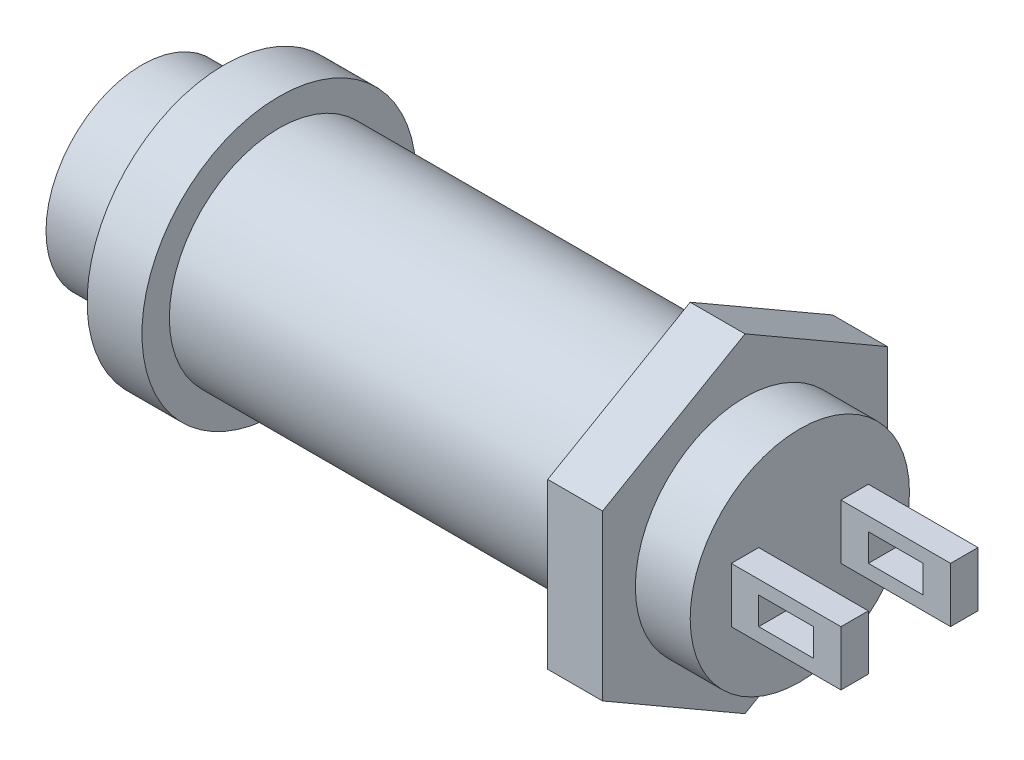
ISO-10303-21;
HEADER;
FILE_DESCRIPTION(('STEP AP214'),'2;1');
FILE_NAME('part.step','',(''),(''),'','','');
FILE_SCHEMA(('AUTOMOTIVE_DESIGN { 1 0 10303 214 1 1 1 1 }'));
ENDSEC;
DATA;
#1=APPLICATION_CONTEXT('core data for automotive mechanical design processes');
#2=APPLICATION_PROTOCOL_DEFINITION('international standard','automotive_design',2000,#1);
#3=PRODUCT_CONTEXT('',#1,'mechanical');
#4=PRODUCT('Part','Part','',(#3));
#5=PRODUCT_RELATED_PRODUCT_CATEGORY('part','',(#4));
#6=PRODUCT_DEFINITION_FORMATION('','',#4);
#7=PRODUCT_DEFINITION_CONTEXT('part definition',#1,'design');
#8=PRODUCT_DEFINITION('design','',#6,#7);
#9=PRODUCT_DEFINITION_SHAPE('','',#8);
#10=(LENGTH_UNIT() NAMED_UNIT(*) SI_UNIT(.MILLI.,.METRE.));
#11=(NAMED_UNIT(*) PLANE_ANGLE_UNIT() SI_UNIT($,.RADIAN.));
#12=(NAMED_UNIT(*) SI_UNIT($,.STERADIAN.) SOLID_ANGLE_UNIT());
#13=UNCERTAINTY_MEASURE_WITH_UNIT(LENGTH_MEASURE(1.E-05),#10,'distance_accuracy_value','');
#14=(GEOMETRIC_REPRESENTATION_CONTEXT(3) GLOBAL_UNCERTAINTY_ASSIGNED_CONTEXT((#13)) GLOBAL_UNIT_ASSIGNED_CONTEXT((#10,
#11,#12)) REPRESENTATION_CONTEXT('',''));
#15=CARTESIAN_POINT('',(0.,0.,0.));
#16=DIRECTION('',(0.,0.,1.));
#17=DIRECTION('',(1.,0.,0.));
#18=AXIS2_PLACEMENT_3D('',#15,#16,#17);
#19=CARTESIAN_POINT('',(28.,-1.00116314183368,2.5));
#20=DIRECTION('',(0.,0.,1.));
#21=DIRECTION('',(1.,0.,0.));
#22=AXIS2_PLACEMENT_3D('',#19,#20,#21);
#23=PLANE('',#22);
#24=DIRECTION('',(0.,1.,0.));
#25=VECTOR('',#24,1.);
#26=CARTESIAN_POINT('',(24.,-1.00116314183368,2.5));
#27=LINE('',#26,#25);
#28=CARTESIAN_POINT('',(24.,-1.00116314183368,2.5));
#29=VERTEX_POINT('',#28);
#30=CARTESIAN_POINT('',(24.,0.998836858166317,2.5));
#31=VERTEX_POINT('',#30);
#32=EDGE_CURVE('E269',#29,#31,#27,.T.);
#33=ORIENTED_EDGE('',*,*,#32,.F.);
#34=DIRECTION('',(-1.,0.,0.));
#35=VECTOR('',#34,1.);
#36=CARTESIAN_POINT('',(28.,-1.00116314183368,2.5));
#37=LINE('',#36,#35);
#38=CARTESIAN_POINT('',(28.,-1.00116314183368,2.5));
#39=VERTEX_POINT('',#38);
#40=EDGE_CURVE('E298',#39,#29,#37,.T.);
#41=ORIENTED_EDGE('',*,*,#40,.F.);
#42=DIRECTION('',(0.,1.,0.));
#43=VECTOR('',#42,1.);
#44=CARTESIAN_POINT('',(28.,-1.00116314183368,2.5));
#45=LINE('',#44,#43);
#46=CARTESIAN_POINT('',(28.,0.998836858166317,2.5));
#47=VERTEX_POINT('',#46);
#48=EDGE_CURVE('E278',#39,#47,#45,.T.);
#49=ORIENTED_EDGE('',*,*,#48,.T.);
#50=DIRECTION('',(-1.,0.,0.));
#51=VECTOR('',#50,1.);
#52=CARTESIAN_POINT('',(28.,0.998836858166317,2.5));
#53=LINE('',#52,#51);
#54=EDGE_CURVE('E289',#47,#31,#53,.T.);
#55=ORIENTED_EDGE('',*,*,#54,.T.);
#56=EDGE_LOOP('',(#33,#41,#49,#55));
#57=FACE_BOUND('',#56,.T.);
#58=DIRECTION('',(1.,0.,0.));
#59=VECTOR('',#58,1.);
#60=CARTESIAN_POINT('',(28.,0.5,2.5));
#61=LINE('',#60,#59);
#62=CARTESIAN_POINT('',(25.,0.5,2.5));
#63=VERTEX_POINT('',#62);
#64=CARTESIAN_POINT('',(27.,0.5,2.5));
#65=VERTEX_POINT('',#64);
#66=EDGE_CURVE('E236',#63,#65,#61,.T.);
#67=ORIENTED_EDGE('',*,*,#66,.T.);
#68=DIRECTION('',(0.,-1.,0.));
#69=VECTOR('',#68,1.);
#70=CARTESIAN_POINT('',(27.,-1.00116314183368,2.5));
#71=LINE('',#70,#69);
#72=CARTESIAN_POINT('',(27.,-0.5,2.5));
#73=VERTEX_POINT('',#72);
#74=EDGE_CURVE('E242',#65,#73,#71,.T.);
#75=ORIENTED_EDGE('',*,*,#74,.T.);
#76=DIRECTION('',(1.,0.,0.));
#77=VECTOR('',#76,1.);
#78=CARTESIAN_POINT('',(28.,-0.5,2.5));
#79=LINE('',#78,#77);
#80=CARTESIAN_POINT('',(25.,-0.5,2.5));
#81=VERTEX_POINT('',#80);
#82=EDGE_CURVE('E222',#81,#73,#79,.T.);
#83=ORIENTED_EDGE('',*,*,#82,.F.);
#84=DIRECTION('',(0.,-1.,0.));
#85=VECTOR('',#84,1.);
#86=CARTESIAN_POINT('',(25.,-1.00116314183368,2.5));
#87=LINE('',#86,#85);
#88=EDGE_CURVE('E230',#63,#81,#87,.T.);
#89=ORIENTED_EDGE('',*,*,#88,.F.);
#90=EDGE_LOOP('',(#67,#75,#83,#89));
#91=FACE_BOUND('',#90,.T.);
#92=ADVANCED_FACE('F33',(#57,#91),#23,.T.);
#93=CARTESIAN_POINT('',(28.,-1.00116314183368,1.5));
#94=DIRECTION('',(0.,0.,1.));
#95=DIRECTION('',(1.,0.,0.));
#96=AXIS2_PLACEMENT_3D('',#93,#94,#95);
#97=PLANE('',#96);
#98=DIRECTION('',(0.,1.,0.));
#99=VECTOR('',#98,1.);
#100=CARTESIAN_POINT('',(24.,-1.00116314183368,1.5));
#101=LINE('',#100,#99);
#102=CARTESIAN_POINT('',(24.,-1.00116314183368,1.5));
#103=VERTEX_POINT('',#102);
#104=CARTESIAN_POINT('',(24.,0.998836858166317,1.5));
#105=VERTEX_POINT('',#104);
#106=EDGE_CURVE('E293',#103,#105,#101,.T.);
#107=ORIENTED_EDGE('',*,*,#106,.T.);
#108=DIRECTION('',(-1.,0.,0.));
#109=VECTOR('',#108,1.);
#110=CARTESIAN_POINT('',(28.,0.998836858166317,1.5));
#111=LINE('',#110,#109);
#112=CARTESIAN_POINT('',(28.,0.998836858166317,1.5));
#113=VERTEX_POINT('',#112);
#114=EDGE_CURVE('E305',#113,#105,#111,.T.);
#115=ORIENTED_EDGE('',*,*,#114,.F.);
#116=DIRECTION('',(0.,1.,0.));
#117=VECTOR('',#116,1.);
#118=CARTESIAN_POINT('',(28.,-1.00116314183368,1.5));
#119=LINE('',#118,#117);
#120=CARTESIAN_POINT('',(28.,-1.00116314183368,1.5));
#121=VERTEX_POINT('',#120);
#122=EDGE_CURVE('E285',#121,#113,#119,.T.);
#123=ORIENTED_EDGE('',*,*,#122,.F.);
#124=DIRECTION('',(-1.,0.,0.));
#125=VECTOR('',#124,1.);
#126=CARTESIAN_POINT('',(28.,-1.00116314183368,1.5));
#127=LINE('',#126,#125);
#128=EDGE_CURVE('E302',#121,#103,#127,.T.);
#129=ORIENTED_EDGE('',*,*,#128,.T.);
#130=EDGE_LOOP('',(#107,#115,#123,#129));
#131=FACE_BOUND('',#130,.T.);
#132=DIRECTION('',(0.,-1.,0.));
#133=VECTOR('',#132,1.);
#134=CARTESIAN_POINT('',(27.,-1.00116314183368,1.5));
#135=LINE('',#134,#133);
#136=CARTESIAN_POINT('',(27.,0.5,1.5));
#137=VERTEX_POINT('',#136);
#138=CARTESIAN_POINT('',(27.,-0.5,1.5));
#139=VERTEX_POINT('',#138);
#140=EDGE_CURVE('E240',#137,#139,#135,.T.);
#141=ORIENTED_EDGE('',*,*,#140,.F.);
#142=DIRECTION('',(1.,0.,0.));
#143=VECTOR('',#142,1.);
#144=CARTESIAN_POINT('',(28.,0.5,1.5));
#145=LINE('',#144,#143);
#146=CARTESIAN_POINT('',(25.,0.5,1.5));
#147=VERTEX_POINT('',#146);
#148=EDGE_CURVE('E234',#147,#137,#145,.T.);
#149=ORIENTED_EDGE('',*,*,#148,.F.);
#150=DIRECTION('',(0.,-1.,0.));
#151=VECTOR('',#150,1.);
#152=CARTESIAN_POINT('',(25.,-1.00116314183368,1.5));
#153=LINE('',#152,#151);
#154=CARTESIAN_POINT('',(25.,-0.5,1.5));
#155=VERTEX_POINT('',#154);
#156=EDGE_CURVE('E227',#147,#155,#153,.T.);
#157=ORIENTED_EDGE('',*,*,#156,.T.);
#158=DIRECTION('',(1.,0.,0.));
#159=VECTOR('',#158,1.);
#160=CARTESIAN_POINT('',(28.,-0.5,1.5));
#161=LINE('',#160,#159);
#162=EDGE_CURVE('E219',#155,#139,#161,.T.);
#163=ORIENTED_EDGE('',*,*,#162,.T.);
#164=EDGE_LOOP('',(#141,#149,#157,#163));
#165=FACE_BOUND('',#164,.T.);
#166=ADVANCED_FACE('F400',(#131,#165),#97,.F.);
#167=CARTESIAN_POINT('',(28.,-1.,-1.5));
#168=DIRECTION('',(0.,0.,1.));
#169=DIRECTION('',(1.,0.,0.));
#170=AXIS2_PLACEMENT_3D('',#167,#168,#169);
#171=PLANE('',#170);
#172=DIRECTION('',(0.,1.,0.));
#173=VECTOR('',#172,1.);
#174=CARTESIAN_POINT('',(24.,-1.,-1.5));
#175=LINE('',#174,#173);
#176=CARTESIAN_POINT('',(24.,-1.,-1.5));
#177=VERTEX_POINT('',#176);
#178=CARTESIAN_POINT('',(24.,1.,-1.5));
#179=VERTEX_POINT('',#178);
#180=EDGE_CURVE('E267',#177,#179,#175,.T.);
#181=ORIENTED_EDGE('',*,*,#180,.F.);
#182=DIRECTION('',(-1.,0.,0.));
#183=VECTOR('',#182,1.);
#184=CARTESIAN_POINT('',(28.,-1.,-1.5));
#185=LINE('',#184,#183);
#186=CARTESIAN_POINT('',(28.,-1.,-1.5));
#187=VERTEX_POINT('',#186);
#188=EDGE_CURVE('E245',#187,#177,#185,.T.);
#189=ORIENTED_EDGE('',*,*,#188,.F.);
#190=DIRECTION('',(0.,1.,0.));
#191=VECTOR('',#190,1.);
#192=CARTESIAN_POINT('',(28.,-1.,-1.5));
#193=LINE('',#192,#191);
#194=CARTESIAN_POINT('',(28.,1.,-1.5));
#195=VERTEX_POINT('',#194);
#196=EDGE_CURVE('E262',#187,#195,#193,.T.);
#197=ORIENTED_EDGE('',*,*,#196,.T.);
#198=DIRECTION('',(-1.,0.,0.));
#199=VECTOR('',#198,1.);
#200=CARTESIAN_POINT('',(28.,1.,-1.5));
#201=LINE('',#200,#199);
#202=EDGE_CURVE('E246',#195,#179,#201,.T.);
#203=ORIENTED_EDGE('',*,*,#202,.T.);
#204=EDGE_LOOP('',(#181,#189,#197,#203));
#205=FACE_BOUND('',#204,.T.);
#206=DIRECTION('',(1.,0.,0.));
#207=VECTOR('',#206,1.);
#208=CARTESIAN_POINT('',(28.,0.5,-1.5));
#209=LINE('',#208,#207);
#210=CARTESIAN_POINT('',(25.,0.5,-1.5));
#211=VERTEX_POINT('',#210);
#212=CARTESIAN_POINT('',(27.,0.5,-1.5));
#213=VERTEX_POINT('',#212);
#214=EDGE_CURVE('E232',#211,#213,#209,.T.);
#215=ORIENTED_EDGE('',*,*,#214,.T.);
#216=DIRECTION('',(0.,-1.,0.));
#217=VECTOR('',#216,1.);
#218=CARTESIAN_POINT('',(27.,-1.,-1.5));
#219=LINE('',#218,#217);
#220=CARTESIAN_POINT('',(27.,-0.5,-1.5));
#221=VERTEX_POINT('',#220);
#222=EDGE_CURVE('E188',#213,#221,#219,.T.);
#223=ORIENTED_EDGE('',*,*,#222,.T.);
#224=DIRECTION('',(1.,0.,0.));
#225=VECTOR('',#224,1.);
#226=CARTESIAN_POINT('',(28.,-0.5,-1.5));
#227=LINE('',#226,#225);
#228=CARTESIAN_POINT('',(25.,-0.5,-1.5));
#229=VERTEX_POINT('',#228);
#230=EDGE_CURVE('E217',#229,#221,#227,.T.);
#231=ORIENTED_EDGE('',*,*,#230,.F.);
#232=DIRECTION('',(0.,-1.,0.));
#233=VECTOR('',#232,1.);
#234=CARTESIAN_POINT('',(25.,-1.,-1.5));
#235=LINE('',#234,#233);
#236=EDGE_CURVE('E224',#211,#229,#235,.T.);
#237=ORIENTED_EDGE('',*,*,#236,.F.);
#238=EDGE_LOOP('',(#215,#223,#231,#237));
#239=FACE_BOUND('',#238,.T.);
#240=ADVANCED_FACE('F406',(#205,#239),#171,.T.);
#241=CARTESIAN_POINT('',(28.,-1.,-2.5));
#242=DIRECTION('',(0.,0.,1.));
#243=DIRECTION('',(1.,0.,0.));
#244=AXIS2_PLACEMENT_3D('',#241,#242,#243);
#245=PLANE('',#244);
#246=DIRECTION('',(0.,1.,0.));
#247=VECTOR('',#246,1.);
#248=CARTESIAN_POINT('',(24.,-1.,-2.5));
#249=LINE('',#248,#247);
#250=CARTESIAN_POINT('',(24.,-1.,-2.5));
#251=VERTEX_POINT('',#250);
#252=CARTESIAN_POINT('',(24.,1.,-2.5));
#253=VERTEX_POINT('',#252);
#254=EDGE_CURVE('E261',#251,#253,#249,.T.);
#255=ORIENTED_EDGE('',*,*,#254,.T.);
#256=DIRECTION('',(-1.,0.,0.));
#257=VECTOR('',#256,1.);
#258=CARTESIAN_POINT('',(28.,1.,-2.5));
#259=LINE('',#258,#257);
#260=CARTESIAN_POINT('',(28.,1.,-2.5));
#261=VERTEX_POINT('',#260);
#262=EDGE_CURVE('E250',#261,#253,#259,.T.);
#263=ORIENTED_EDGE('',*,*,#262,.F.);
#264=DIRECTION('',(0.,1.,0.));
#265=VECTOR('',#264,1.);
#266=CARTESIAN_POINT('',(28.,-1.,-2.5));
#267=LINE('',#266,#265);
#268=CARTESIAN_POINT('',(28.,-1.,-2.5));
#269=VERTEX_POINT('',#268);
#270=EDGE_CURVE('E271',#269,#261,#267,.T.);
#271=ORIENTED_EDGE('',*,*,#270,.F.);
#272=DIRECTION('',(-1.,0.,0.));
#273=VECTOR('',#272,1.);
#274=CARTESIAN_POINT('',(28.,-1.,-2.5));
#275=LINE('',#274,#273);
#276=EDGE_CURVE('E253',#269,#251,#275,.T.);
#277=ORIENTED_EDGE('',*,*,#276,.T.);
#278=EDGE_LOOP('',(#255,#263,#271,#277));
#279=FACE_BOUND('',#278,.T.);
#280=DIRECTION('',(0.,1.,0.));
#281=VECTOR('',#280,1.);
#282=CARTESIAN_POINT('',(27.,-0.5,-2.5));
#283=LINE('',#282,#281);
#284=CARTESIAN_POINT('',(27.,-0.5,-2.5));
#285=VERTEX_POINT('',#284);
#286=CARTESIAN_POINT('',(27.,0.5,-2.5));
#287=VERTEX_POINT('',#286);
#288=EDGE_CURVE('E185',#285,#287,#283,.T.);
#289=ORIENTED_EDGE('',*,*,#288,.T.);
#290=DIRECTION('',(-1.,0.,0.));
#291=VECTOR('',#290,1.);
#292=CARTESIAN_POINT('',(27.,0.5,-2.5));
#293=LINE('',#292,#291);
#294=CARTESIAN_POINT('',(25.,0.5,-2.5));
#295=VERTEX_POINT('',#294);
#296=EDGE_CURVE('E195',#287,#295,#293,.T.);
#297=ORIENTED_EDGE('',*,*,#296,.T.);
#298=DIRECTION('',(0.,1.,0.));
#299=VECTOR('',#298,1.);
#300=CARTESIAN_POINT('',(25.,-0.5,-2.5));
#301=LINE('',#300,#299);
#302=CARTESIAN_POINT('',(25.,-0.5,-2.5));
#303=VERTEX_POINT('',#302);
#304=EDGE_CURVE('E202',#303,#295,#301,.T.);
#305=ORIENTED_EDGE('',*,*,#304,.F.);
#306=DIRECTION('',(-1.,0.,0.));
#307=VECTOR('',#306,1.);
#308=CARTESIAN_POINT('',(27.,-0.5,-2.5));
#309=LINE('',#308,#307);
#310=EDGE_CURVE('E207',#285,#303,#309,.T.);
#311=ORIENTED_EDGE('',*,*,#310,.F.);
#312=EDGE_LOOP('',(#289,#297,#305,#311));
#313=FACE_BOUND('',#312,.T.);
#314=ADVANCED_FACE('F205',(#279,#313),#245,.F.);
#315=CARTESIAN_POINT('',(20.,4.,0.));
#316=DIRECTION('',(-1.,0.,0.));
#317=DIRECTION('',(0.,-1.,0.));
#318=AXIS2_PLACEMENT_3D('',#315,#316,#317);
#319=PLANE('',#318);
#320=CARTESIAN_POINT('',(20.,0.,0.));
#321=DIRECTION('',(1.,0.,0.));
#322=DIRECTION('',(0.,1.,0.));
#323=AXIS2_PLACEMENT_3D('',#320,#321,#322);
#324=CIRCLE('',#323,4.);
#325=CARTESIAN_POINT('',(20.,4.,0.));
#326=VERTEX_POINT('',#325);
#327=EDGE_CURVE('E359',#326,#326,#324,.T.);
#328=ORIENTED_EDGE('',*,*,#327,.T.);
#329=EDGE_LOOP('',(#328));
#330=FACE_BOUND('',#329,.T.);
#331=DIRECTION('',(0.,-0.499999999999995,-0.866025403784442));
#332=VECTOR('',#331,1.);
#333=CARTESIAN_POINT('',(20.,-4.50000000000001,2.59807621135329));
#334=LINE('',#333,#332);
#335=CARTESIAN_POINT('',(20.,-3.00000000000002,5.19615242270662));
#336=VERTEX_POINT('',#335);
#337=CARTESIAN_POINT('',(20.,-6.,0.));
#338=VERTEX_POINT('',#337);
#339=EDGE_CURVE('E317',#336,#338,#334,.T.);
#340=ORIENTED_EDGE('',*,*,#339,.F.);
#341=DIRECTION('',(0.,-1.,0.));
#342=VECTOR('',#341,1.);
#343=CARTESIAN_POINT('',(20.,0.,5.19615242270663));
#344=LINE('',#343,#342);
#345=CARTESIAN_POINT('',(20.,2.99999999999999,5.19615242270664));
#346=VERTEX_POINT('',#345);
#347=EDGE_CURVE('E310',#346,#336,#344,.T.);
#348=ORIENTED_EDGE('',*,*,#347,.F.);
#349=DIRECTION('',(0.,-0.500000000000001,0.866025403784438));
#350=VECTOR('',#349,1.);
#351=CARTESIAN_POINT('',(20.,4.49999999999999,2.59807621135332));
#352=LINE('',#351,#350);
#353=CARTESIAN_POINT('',(20.,6.,0.));
#354=VERTEX_POINT('',#353);
#355=EDGE_CURVE('E343',#354,#346,#352,.T.);
#356=ORIENTED_EDGE('',*,*,#355,.F.);
#357=DIRECTION('',(0.,0.499999999999995,0.866025403784442));
#358=VECTOR('',#357,1.);
#359=CARTESIAN_POINT('',(20.,4.50000000000003,-2.5980762113533));
#360=LINE('',#359,#358);
#361=CARTESIAN_POINT('',(20.,3.00000000000006,-5.1961524227066));
#362=VERTEX_POINT('',#361);
#363=EDGE_CURVE('E338',#362,#354,#360,.T.);
#364=ORIENTED_EDGE('',*,*,#363,.F.);
#365=DIRECTION('',(0.,1.,0.));
#366=VECTOR('',#365,1.);
#367=CARTESIAN_POINT('',(20.,0.,-5.19615242270663));
#368=LINE('',#367,#366);
#369=CARTESIAN_POINT('',(20.,-2.99999999999995,-5.19615242270666));
#370=VERTEX_POINT('',#369);
#371=EDGE_CURVE('E331',#370,#362,#368,.T.);
#372=ORIENTED_EDGE('',*,*,#371,.F.);
#373=DIRECTION('',(0.,0.500000000000007,-0.866025403784435));
#374=VECTOR('',#373,1.);
#375=CARTESIAN_POINT('',(20.,-4.49999999999998,-2.59807621135335));
#376=LINE('',#375,#374);
#377=EDGE_CURVE('E324',#338,#370,#376,.T.);
#378=ORIENTED_EDGE('',*,*,#377,.F.);
#379=EDGE_LOOP('',(#340,#348,#356,#364,#372,#378));
#380=FACE_BOUND('',#379,.T.);
#381=ADVANCED_FACE('F450',(#330,#380),#319,.T.);
#382=CARTESIAN_POINT('',(22.,6.,0.));
#383=DIRECTION('',(1.,0.,0.));
#384=DIRECTION('',(0.,1.,0.));
#385=AXIS2_PLACEMENT_3D('',#382,#383,#384);
#386=PLANE('',#385);
#387=CARTESIAN_POINT('',(22.,0.,0.));
#388=DIRECTION('',(1.,0.,0.));
#389=DIRECTION('',(0.,1.,0.));
#390=AXIS2_PLACEMENT_3D('',#387,#388,#389);
#391=CIRCLE('',#390,4.);
#392=CARTESIAN_POINT('',(22.,4.,0.));
#393=VERTEX_POINT('',#392);
#394=EDGE_CURVE('E356',#393,#393,#391,.T.);
#395=ORIENTED_EDGE('',*,*,#394,.F.);
#396=EDGE_LOOP('',(#395));
#397=FACE_BOUND('',#396,.T.);
#398=DIRECTION('',(0.,-0.500000000000001,0.866025403784438));
#399=VECTOR('',#398,1.);
#400=CARTESIAN_POINT('',(22.,4.49999999999999,2.59807621135332));
#401=LINE('',#400,#399);
#402=CARTESIAN_POINT('',(22.,6.,0.));
#403=VERTEX_POINT('',#402);
#404=CARTESIAN_POINT('',(22.,2.99999999999999,5.19615242270664));
#405=VERTEX_POINT('',#404);
#406=EDGE_CURVE('E342',#403,#405,#401,.T.);
#407=ORIENTED_EDGE('',*,*,#406,.T.);
#408=DIRECTION('',(0.,-1.,0.));
#409=VECTOR('',#408,1.);
#410=CARTESIAN_POINT('',(22.,0.,5.19615242270663));
#411=LINE('',#410,#409);
#412=CARTESIAN_POINT('',(22.,-3.00000000000002,5.19615242270662));
#413=VERTEX_POINT('',#412);
#414=EDGE_CURVE('E301',#405,#413,#411,.T.);
#415=ORIENTED_EDGE('',*,*,#414,.T.);
#416=DIRECTION('',(0.,-0.499999999999995,-0.866025403784442));
#417=VECTOR('',#416,1.);
#418=CARTESIAN_POINT('',(22.,-4.50000000000001,2.59807621135329));
#419=LINE('',#418,#417);
#420=CARTESIAN_POINT('',(22.,-6.,0.));
#421=VERTEX_POINT('',#420);
#422=EDGE_CURVE('E312',#413,#421,#419,.T.);
#423=ORIENTED_EDGE('',*,*,#422,.T.);
#424=DIRECTION('',(0.,0.500000000000007,-0.866025403784435));
#425=VECTOR('',#424,1.);
#426=CARTESIAN_POINT('',(22.,-4.49999999999998,-2.59807621135335));
#427=LINE('',#426,#425);
#428=CARTESIAN_POINT('',(22.,-2.99999999999995,-5.19615242270666));
#429=VERTEX_POINT('',#428);
#430=EDGE_CURVE('E321',#421,#429,#427,.T.);
#431=ORIENTED_EDGE('',*,*,#430,.T.);
#432=DIRECTION('',(0.,1.,0.));
#433=VECTOR('',#432,1.);
#434=CARTESIAN_POINT('',(22.,0.,-5.19615242270663));
#435=LINE('',#434,#433);
#436=CARTESIAN_POINT('',(22.,3.00000000000006,-5.1961524227066));
#437=VERTEX_POINT('',#436);
#438=EDGE_CURVE('E328',#429,#437,#435,.T.);
#439=ORIENTED_EDGE('',*,*,#438,.T.);
#440=DIRECTION('',(0.,0.499999999999995,0.866025403784442));
#441=VECTOR('',#440,1.);
#442=CARTESIAN_POINT('',(22.,4.50000000000003,-2.5980762113533));
#443=LINE('',#442,#441);
#444=EDGE_CURVE('E335',#437,#403,#443,.T.);
#445=ORIENTED_EDGE('',*,*,#444,.T.);
#446=EDGE_LOOP('',(#407,#415,#423,#431,#439,#445));
#447=FACE_BOUND('',#446,.T.);
#448=ADVANCED_FACE('F397',(#397,#447),#386,.T.);
#449=CARTESIAN_POINT('',(0.,0.,0.));
#450=DIRECTION('',(-1.,0.,0.));
#451=DIRECTION('',(0.,-1.,0.));
#452=AXIS2_PLACEMENT_3D('',#449,#450,#451);
#453=PLANE('',#452);
#454=CARTESIAN_POINT('',(0.,0.,0.));
#455=DIRECTION('',(1.,0.,0.));
#456=DIRECTION('',(0.,1.,0.));
#457=AXIS2_PLACEMENT_3D('',#454,#455,#456);
#458=CIRCLE('',#457,0.5);
#459=CARTESIAN_POINT('',(0.,0.5,0.));
#460=VERTEX_POINT('',#459);
#461=EDGE_CURVE('E11',#460,#460,#458,.T.);
#462=ORIENTED_EDGE('',*,*,#461,.F.);
#463=EDGE_LOOP('',(#462));
#464=FACE_BOUND('',#463,.T.);
#465=ADVANCED_FACE('F35',(#464),#453,.T.);
#466=CARTESIAN_POINT('',(24.,0.,0.));
#467=DIRECTION('',(1.,0.,0.));
#468=DIRECTION('',(0.,1.,0.));
#469=AXIS2_PLACEMENT_3D('',#466,#467,#468);
#470=CYLINDRICAL_SURFACE('',#469,0.5);
#471=ORIENTED_EDGE('',*,*,#461,.T.);
#472=EDGE_LOOP('',(#471));
#473=FACE_BOUND('',#472,.T.);
#474=CARTESIAN_POINT('',(10.,0.,0.));
#475=DIRECTION('',(1.,0.,0.));
#476=DIRECTION('',(0.,1.,0.));
#477=AXIS2_PLACEMENT_3D('',#474,#475,#476);
#478=CIRCLE('',#477,0.5);
#479=CARTESIAN_POINT('',(10.,0.5,0.));
#480=VERTEX_POINT('',#479);
#481=EDGE_CURVE('E41',#480,#480,#478,.T.);
#482=ORIENTED_EDGE('',*,*,#481,.F.);
#483=EDGE_LOOP('',(#482));
#484=FACE_BOUND('',#483,.T.);
#485=ADVANCED_FACE('F388',(#473,#484),#470,.T.);
#486=CARTESIAN_POINT('',(10.,0.5,0.));
#487=DIRECTION('',(-1.,0.,0.));
#488=DIRECTION('',(0.,-1.,0.));
#489=AXIS2_PLACEMENT_3D('',#486,#487,#488);
#490=PLANE('',#489);
#491=ORIENTED_EDGE('',*,*,#481,.T.);
#492=EDGE_LOOP('',(#491));
#493=FACE_BOUND('',#492,.T.);
#494=CARTESIAN_POINT('',(10.,0.,0.));
#495=DIRECTION('',(1.,0.,0.));
#496=DIRECTION('',(0.,1.,0.));
#497=AXIS2_PLACEMENT_3D('',#494,#495,#496);
#498=CIRCLE('',#497,2.5);
#499=CARTESIAN_POINT('',(10.,2.5,0.));
#500=VERTEX_POINT('',#499);
#501=EDGE_CURVE('E380',#500,#500,#498,.T.);
#502=ORIENTED_EDGE('',*,*,#501,.F.);
#503=EDGE_LOOP('',(#502));
#504=FACE_BOUND('',#503,.T.);
#505=ADVANCED_FACE('F385',(#493,#504),#490,.T.);
#506=CARTESIAN_POINT('',(24.,0.,0.));
#507=DIRECTION('',(1.,0.,0.));
#508=DIRECTION('',(0.,1.,0.));
#509=AXIS2_PLACEMENT_3D('',#506,#507,#508);
#510=CYLINDRICAL_SURFACE('',#509,2.5);
#511=ORIENTED_EDGE('',*,*,#501,.T.);
#512=EDGE_LOOP('',(#511));
#513=FACE_BOUND('',#512,.T.);
#514=CARTESIAN_POINT('',(0.,0.,0.));
#515=DIRECTION('',(1.,0.,0.));
#516=DIRECTION('',(0.,1.,0.));
#517=AXIS2_PLACEMENT_3D('',#514,#515,#516);
#518=CIRCLE('',#517,2.5);
#519=CARTESIAN_POINT('',(0.,2.5,0.));
#520=VERTEX_POINT('',#519);
#521=EDGE_CURVE('E377',#520,#520,#518,.T.);
#522=ORIENTED_EDGE('',*,*,#521,.F.);
#523=EDGE_LOOP('',(#522));
#524=FACE_BOUND('',#523,.T.);
#525=ADVANCED_FACE('F395',(#513,#524),#510,.F.);
#526=CARTESIAN_POINT('',(0.,2.5,0.));
#527=DIRECTION('',(-1.,0.,0.));
#528=DIRECTION('',(0.,-1.,0.));
#529=AXIS2_PLACEMENT_3D('',#526,#527,#528);
#530=PLANE('',#529);
#531=ORIENTED_EDGE('',*,*,#521,.T.);
#532=EDGE_LOOP('',(#531));
#533=FACE_BOUND('',#532,.T.);
#534=CARTESIAN_POINT('',(0.,0.,0.));
#535=DIRECTION('',(1.,0.,0.));
#536=DIRECTION('',(0.,1.,0.));
#537=AXIS2_PLACEMENT_3D('',#534,#535,#536);
#538=CIRCLE('',#537,3.5);
#539=CARTESIAN_POINT('',(0.,3.5,0.));
#540=VERTEX_POINT('',#539);
#541=EDGE_CURVE('E374',#540,#540,#538,.T.);
#542=ORIENTED_EDGE('',*,*,#541,.F.);
#543=EDGE_LOOP('',(#542));
#544=FACE_BOUND('',#543,.T.);
#545=ADVANCED_FACE('F473',(#533,#544),#530,.T.);
#546=CARTESIAN_POINT('',(24.,0.,0.));
#547=DIRECTION('',(1.,0.,0.));
#548=DIRECTION('',(0.,1.,0.));
#549=AXIS2_PLACEMENT_3D('',#546,#547,#548);
#550=CYLINDRICAL_SURFACE('',#549,3.5);
#551=ORIENTED_EDGE('',*,*,#541,.T.);
#552=EDGE_LOOP('',(#551));
#553=FACE_BOUND('',#552,.T.);
#554=CARTESIAN_POINT('',(3.,0.,0.));
#555=DIRECTION('',(1.,0.,0.));
#556=DIRECTION('',(0.,1.,0.));
#557=AXIS2_PLACEMENT_3D('',#554,#555,#556);
#558=CIRCLE('',#557,3.5);
#559=CARTESIAN_POINT('',(3.,3.5,0.));
#560=VERTEX_POINT('',#559);
#561=EDGE_CURVE('E371',#560,#560,#558,.T.);
#562=ORIENTED_EDGE('',*,*,#561,.F.);
#563=EDGE_LOOP('',(#562));
#564=FACE_BOUND('',#563,.T.);
#565=ADVANCED_FACE('F469',(#553,#564),#550,.T.);
#566=CARTESIAN_POINT('',(3.,3.5,0.));
#567=DIRECTION('',(-1.,0.,0.));
#568=DIRECTION('',(0.,-1.,0.));
#569=AXIS2_PLACEMENT_3D('',#566,#567,#568);
#570=PLANE('',#569);
#571=ORIENTED_EDGE('',*,*,#561,.T.);
#572=EDGE_LOOP('',(#571));
#573=FACE_BOUND('',#572,.T.);
#574=CARTESIAN_POINT('',(3.,0.,0.));
#575=DIRECTION('',(1.,0.,0.));
#576=DIRECTION('',(0.,1.,0.));
#577=AXIS2_PLACEMENT_3D('',#574,#575,#576);
#578=CIRCLE('',#577,5.);
#579=CARTESIAN_POINT('',(3.,5.,0.));
#580=VERTEX_POINT('',#579);
#581=EDGE_CURVE('E368',#580,#580,#578,.T.);
#582=ORIENTED_EDGE('',*,*,#581,.F.);
#583=EDGE_LOOP('',(#582));
#584=FACE_BOUND('',#583,.T.);
#585=ADVANCED_FACE('F465',(#573,#584),#570,.T.);
#586=CARTESIAN_POINT('',(24.,0.,0.));
#587=DIRECTION('',(1.,0.,0.));
#588=DIRECTION('',(0.,1.,0.));
#589=AXIS2_PLACEMENT_3D('',#586,#587,#588);
#590=CYLINDRICAL_SURFACE('',#589,5.);
#591=ORIENTED_EDGE('',*,*,#581,.T.);
#592=EDGE_LOOP('',(#591));
#593=FACE_BOUND('',#592,.T.);
#594=CARTESIAN_POINT('',(5.,0.,0.));
#595=DIRECTION('',(1.,0.,0.));
#596=DIRECTION('',(0.,1.,0.));
#597=AXIS2_PLACEMENT_3D('',#594,#595,#596);
#598=CIRCLE('',#597,5.);
#599=CARTESIAN_POINT('',(5.,5.,0.));
#600=VERTEX_POINT('',#599);
#601=EDGE_CURVE('E365',#600,#600,#598,.T.);
#602=ORIENTED_EDGE('',*,*,#601,.F.);
#603=EDGE_LOOP('',(#602));
#604=FACE_BOUND('',#603,.T.);
#605=ADVANCED_FACE('F461',(#593,#604),#590,.T.);
#606=CARTESIAN_POINT('',(5.,5.,0.));
#607=DIRECTION('',(1.,0.,0.));
#608=DIRECTION('',(0.,1.,0.));
#609=AXIS2_PLACEMENT_3D('',#606,#607,#608);
#610=PLANE('',#609);
#611=ORIENTED_EDGE('',*,*,#601,.T.);
#612=EDGE_LOOP('',(#611));
#613=FACE_BOUND('',#612,.T.);
#614=CARTESIAN_POINT('',(5.,0.,0.));
#615=DIRECTION('',(1.,0.,0.));
#616=DIRECTION('',(0.,1.,0.));
#617=AXIS2_PLACEMENT_3D('',#614,#615,#616);
#618=CIRCLE('',#617,4.);
#619=CARTESIAN_POINT('',(5.,4.,0.));
#620=VERTEX_POINT('',#619);
#621=EDGE_CURVE('E362',#620,#620,#618,.T.);
#622=ORIENTED_EDGE('',*,*,#621,.F.);
#623=EDGE_LOOP('',(#622));
#624=FACE_BOUND('',#623,.T.);
#625=ADVANCED_FACE('F457',(#613,#624),#610,.T.);
#626=CARTESIAN_POINT('',(24.,0.,0.));
#627=DIRECTION('',(1.,0.,0.));
#628=DIRECTION('',(0.,1.,0.));
#629=AXIS2_PLACEMENT_3D('',#626,#627,#628);
#630=CYLINDRICAL_SURFACE('',#629,4.);
#631=ORIENTED_EDGE('',*,*,#621,.T.);
#632=EDGE_LOOP('',(#631));
#633=FACE_BOUND('',#632,.T.);
#634=ORIENTED_EDGE('',*,*,#327,.F.);
#635=EDGE_LOOP('',(#634));
#636=FACE_BOUND('',#635,.T.);
#637=ADVANCED_FACE('F446',(#633,#636),#630,.T.);
#638=CARTESIAN_POINT('',(24.,0.,0.));
#639=DIRECTION('',(1.,0.,0.));
#640=DIRECTION('',(0.,1.,0.));
#641=AXIS2_PLACEMENT_3D('',#638,#639,#640);
#642=CYLINDRICAL_SURFACE('',#641,4.);
#643=ORIENTED_EDGE('',*,*,#394,.T.);
#644=EDGE_LOOP('',(#643));
#645=FACE_BOUND('',#644,.T.);
#646=CARTESIAN_POINT('',(24.,0.,0.));
#647=DIRECTION('',(1.,0.,0.));
#648=DIRECTION('',(0.,1.,0.));
#649=AXIS2_PLACEMENT_3D('',#646,#647,#648);
#650=CIRCLE('',#649,4.);
#651=CARTESIAN_POINT('',(24.,4.,0.));
#652=VERTEX_POINT('',#651);
#653=EDGE_CURVE('E352',#652,#652,#650,.T.);
#654=ORIENTED_EDGE('',*,*,#653,.F.);
#655=EDGE_LOOP('',(#654));
#656=FACE_BOUND('',#655,.T.);
#657=ADVANCED_FACE('F442',(#645,#656),#642,.T.);
#658=CARTESIAN_POINT('',(24.,4.,0.));
#659=DIRECTION('',(1.,0.,0.));
#660=DIRECTION('',(0.,1.,0.));
#661=AXIS2_PLACEMENT_3D('',#658,#659,#660);
#662=PLANE('',#661);
#663=ORIENTED_EDGE('',*,*,#180,.T.);
#664=DIRECTION('',(0.,0.,-1.));
#665=VECTOR('',#664,1.);
#666=CARTESIAN_POINT('',(24.,1.,-1.5));
#667=LINE('',#666,#665);
#668=EDGE_CURVE('E265',#179,#253,#667,.T.);
#669=ORIENTED_EDGE('',*,*,#668,.T.);
#670=ORIENTED_EDGE('',*,*,#254,.F.);
#671=DIRECTION('',(0.,0.,-1.));
#672=VECTOR('',#671,1.);
#673=CARTESIAN_POINT('',(24.,-1.,-1.5));
#674=LINE('',#673,#672);
#675=EDGE_CURVE('E258',#177,#251,#674,.T.);
#676=ORIENTED_EDGE('',*,*,#675,.F.);
#677=EDGE_LOOP('',(#663,#669,#670,#676));
#678=FACE_BOUND('',#677,.T.);
#679=ORIENTED_EDGE('',*,*,#32,.T.);
#680=DIRECTION('',(0.,0.,-1.));
#681=VECTOR('',#680,1.);
#682=CARTESIAN_POINT('',(24.,0.998836858166317,2.5));
#683=LINE('',#682,#681);
#684=EDGE_CURVE('E291',#31,#105,#683,.T.);
#685=ORIENTED_EDGE('',*,*,#684,.T.);
#686=ORIENTED_EDGE('',*,*,#106,.F.);
#687=DIRECTION('',(0.,0.,-1.));
#688=VECTOR('',#687,1.);
#689=CARTESIAN_POINT('',(24.,-1.00116314183368,2.5));
#690=LINE('',#689,#688);
#691=EDGE_CURVE('E282',#29,#103,#690,.T.);
#692=ORIENTED_EDGE('',*,*,#691,.F.);
#693=EDGE_LOOP('',(#679,#685,#686,#692));
#694=FACE_BOUND('',#693,.T.);
#695=ORIENTED_EDGE('',*,*,#653,.T.);
#696=EDGE_LOOP('',(#695));
#697=FACE_BOUND('',#696,.T.);
#698=ADVANCED_FACE('F438',(#678,#694,#697),#662,.T.);
#699=CARTESIAN_POINT('',(20.,4.49999999999999,2.59807621135332));
#700=DIRECTION('',(0.,0.866025403784438,0.500000000000001));
#701=DIRECTION('',(0.,-0.500000000000001,0.866025403784438));
#702=AXIS2_PLACEMENT_3D('',#699,#700,#701);
#703=PLANE('',#702);
#704=ORIENTED_EDGE('',*,*,#406,.F.);
#705=DIRECTION('',(1.,0.,0.));
#706=VECTOR('',#705,1.);
#707=CARTESIAN_POINT('',(20.,6.,0.));
#708=LINE('',#707,#706);
#709=EDGE_CURVE('E346',#354,#403,#708,.T.);
#710=ORIENTED_EDGE('',*,*,#709,.F.);
#711=ORIENTED_EDGE('',*,*,#355,.T.);
#712=DIRECTION('',(1.,0.,0.));
#713=VECTOR('',#712,1.);
#714=CARTESIAN_POINT('',(20.,2.99999999999999,5.19615242270664));
#715=LINE('',#714,#713);
#716=EDGE_CURVE('E349',#346,#405,#715,.T.);
#717=ORIENTED_EDGE('',*,*,#716,.T.);
#718=EDGE_LOOP('',(#704,#710,#711,#717));
#719=FACE_BOUND('',#718,.T.);
#720=ADVANCED_FACE('F434',(#719),#703,.T.);
#721=CARTESIAN_POINT('',(20.,4.50000000000003,-2.5980762113533));
#722=DIRECTION('',(0.,0.866025403784442,-0.499999999999995));
#723=DIRECTION('',(0.,0.499999999999995,0.866025403784442));
#724=AXIS2_PLACEMENT_3D('',#721,#722,#723);
#725=PLANE('',#724);
#726=ORIENTED_EDGE('',*,*,#444,.F.);
#727=DIRECTION('',(1.,0.,0.));
#728=VECTOR('',#727,1.);
#729=CARTESIAN_POINT('',(20.,3.00000000000006,-5.1961524227066));
#730=LINE('',#729,#728);
#731=EDGE_CURVE('E336',#362,#437,#730,.T.);
#732=ORIENTED_EDGE('',*,*,#731,.F.);
#733=ORIENTED_EDGE('',*,*,#363,.T.);
#734=ORIENTED_EDGE('',*,*,#709,.T.);
#735=EDGE_LOOP('',(#726,#732,#733,#734));
#736=FACE_BOUND('',#735,.T.);
#737=ADVANCED_FACE('F430',(#736),#725,.T.);
#738=CARTESIAN_POINT('',(20.,0.,-5.19615242270663));
#739=DIRECTION('',(0.,0.,-1.));
#740=DIRECTION('',(0.,1.,0.));
#741=AXIS2_PLACEMENT_3D('',#738,#739,#740);
#742=PLANE('',#741);
#743=ORIENTED_EDGE('',*,*,#438,.F.);
#744=DIRECTION('',(1.,0.,0.));
#745=VECTOR('',#744,1.);
#746=CARTESIAN_POINT('',(20.,-2.99999999999995,-5.19615242270666));
#747=LINE('',#746,#745);
#748=EDGE_CURVE('E329',#370,#429,#747,.T.);
#749=ORIENTED_EDGE('',*,*,#748,.F.);
#750=ORIENTED_EDGE('',*,*,#371,.T.);
#751=ORIENTED_EDGE('',*,*,#731,.T.);
#752=EDGE_LOOP('',(#743,#749,#750,#751));
#753=FACE_BOUND('',#752,.T.);
#754=ADVANCED_FACE('F426',(#753),#742,.T.);
#755=CARTESIAN_POINT('',(20.,-4.49999999999998,-2.59807621135335));
#756=DIRECTION('',(0.,-0.866025403784435,-0.500000000000007));
#757=DIRECTION('',(0.,0.500000000000007,-0.866025403784435));
#758=AXIS2_PLACEMENT_3D('',#755,#756,#757);
#759=PLANE('',#758);
#760=ORIENTED_EDGE('',*,*,#430,.F.);
#761=DIRECTION('',(1.,0.,0.));
#762=VECTOR('',#761,1.);
#763=CARTESIAN_POINT('',(20.,-6.,0.));
#764=LINE('',#763,#762);
#765=EDGE_CURVE('E322',#338,#421,#764,.T.);
#766=ORIENTED_EDGE('',*,*,#765,.F.);
#767=ORIENTED_EDGE('',*,*,#377,.T.);
#768=ORIENTED_EDGE('',*,*,#748,.T.);
#769=EDGE_LOOP('',(#760,#766,#767,#768));
#770=FACE_BOUND('',#769,.T.);
#771=ADVANCED_FACE('F422',(#770),#759,.T.);
#772=CARTESIAN_POINT('',(20.,-4.50000000000001,2.59807621135329));
#773=DIRECTION('',(0.,-0.866025403784442,0.499999999999995));
#774=DIRECTION('',(0.,-0.499999999999995,-0.866025403784442));
#775=AXIS2_PLACEMENT_3D('',#772,#773,#774);
#776=PLANE('',#775);
#777=ORIENTED_EDGE('',*,*,#422,.F.);
#778=DIRECTION('',(1.,0.,0.));
#779=VECTOR('',#778,1.);
#780=CARTESIAN_POINT('',(20.,-3.00000000000002,5.19615242270662));
#781=LINE('',#780,#779);
#782=EDGE_CURVE('E315',#336,#413,#781,.T.);
#783=ORIENTED_EDGE('',*,*,#782,.F.);
#784=ORIENTED_EDGE('',*,*,#339,.T.);
#785=ORIENTED_EDGE('',*,*,#765,.T.);
#786=EDGE_LOOP('',(#777,#783,#784,#785));
#787=FACE_BOUND('',#786,.T.);
#788=ADVANCED_FACE('F418',(#787),#776,.T.);
#789=CARTESIAN_POINT('',(20.,0.,5.19615242270663));
#790=DIRECTION('',(0.,0.,1.));
#791=DIRECTION('',(0.,-1.,0.));
#792=AXIS2_PLACEMENT_3D('',#789,#790,#791);
#793=PLANE('',#792);
#794=ORIENTED_EDGE('',*,*,#414,.F.);
#795=ORIENTED_EDGE('',*,*,#716,.F.);
#796=ORIENTED_EDGE('',*,*,#347,.T.);
#797=ORIENTED_EDGE('',*,*,#782,.T.);
#798=EDGE_LOOP('',(#794,#795,#796,#797));
#799=FACE_BOUND('',#798,.T.);
#800=ADVANCED_FACE('F414',(#799),#793,.T.);
#801=CARTESIAN_POINT('',(28.,-1.00116314183368,2.5));
#802=DIRECTION('',(0.,1.,0.));
#803=DIRECTION('',(0.,0.,1.));
#804=AXIS2_PLACEMENT_3D('',#801,#802,#803);
#805=PLANE('',#804);
#806=ORIENTED_EDGE('',*,*,#691,.T.);
#807=ORIENTED_EDGE('',*,*,#128,.F.);
#808=DIRECTION('',(0.,0.,-1.));
#809=VECTOR('',#808,1.);
#810=CARTESIAN_POINT('',(28.,-1.00116314183368,2.5));
#811=LINE('',#810,#809);
#812=EDGE_CURVE('E287',#39,#121,#811,.T.);
#813=ORIENTED_EDGE('',*,*,#812,.F.);
#814=ORIENTED_EDGE('',*,*,#40,.T.);
#815=EDGE_LOOP('',(#806,#807,#813,#814));
#816=FACE_BOUND('',#815,.T.);
#817=ADVANCED_FACE('F417',(#816),#805,.F.);
#818=CARTESIAN_POINT('',(28.,0.998836858166317,2.5));
#819=DIRECTION('',(0.,1.,0.));
#820=DIRECTION('',(0.,0.,1.));
#821=AXIS2_PLACEMENT_3D('',#818,#819,#820);
#822=PLANE('',#821);
#823=ORIENTED_EDGE('',*,*,#684,.F.);
#824=ORIENTED_EDGE('',*,*,#54,.F.);
#825=DIRECTION('',(0.,0.,-1.));
#826=VECTOR('',#825,1.);
#827=CARTESIAN_POINT('',(28.,0.998836858166317,2.5));
#828=LINE('',#827,#826);
#829=EDGE_CURVE('E281',#47,#113,#828,.T.);
#830=ORIENTED_EDGE('',*,*,#829,.T.);
#831=ORIENTED_EDGE('',*,*,#114,.T.);
#832=EDGE_LOOP('',(#823,#824,#830,#831));
#833=FACE_BOUND('',#832,.T.);
#834=ADVANCED_FACE('F413',(#833),#822,.T.);
#835=CARTESIAN_POINT('',(28.,0.,0.));
#836=DIRECTION('',(-1.,0.,0.));
#837=DIRECTION('',(0.,0.,1.));
#838=AXIS2_PLACEMENT_3D('',#835,#836,#837);
#839=PLANE('',#838);
#840=ORIENTED_EDGE('',*,*,#48,.F.);
#841=ORIENTED_EDGE('',*,*,#812,.T.);
#842=ORIENTED_EDGE('',*,*,#122,.T.);
#843=ORIENTED_EDGE('',*,*,#829,.F.);
#844=EDGE_LOOP('',(#840,#841,#842,#843));
#845=FACE_BOUND('',#844,.T.);
#846=ADVANCED_FACE('F588',(#845),#839,.F.);
#847=CARTESIAN_POINT('',(28.,-1.,-1.5));
#848=DIRECTION('',(0.,1.,0.));
#849=DIRECTION('',(0.,0.,1.));
#850=AXIS2_PLACEMENT_3D('',#847,#848,#849);
#851=PLANE('',#850);
#852=ORIENTED_EDGE('',*,*,#675,.T.);
#853=ORIENTED_EDGE('',*,*,#276,.F.);
#854=DIRECTION('',(0.,0.,-1.));
#855=VECTOR('',#854,1.);
#856=CARTESIAN_POINT('',(28.,-1.,-1.5));
#857=LINE('',#856,#855);
#858=EDGE_CURVE('E249',#187,#269,#857,.T.);
#859=ORIENTED_EDGE('',*,*,#858,.F.);
#860=ORIENTED_EDGE('',*,*,#188,.T.);
#861=EDGE_LOOP('',(#852,#853,#859,#860));
#862=FACE_BOUND('',#861,.T.);
#863=ADVANCED_FACE('F595',(#862),#851,.F.);
#864=CARTESIAN_POINT('',(28.,1.,-1.5));
#865=DIRECTION('',(0.,1.,0.));
#866=DIRECTION('',(0.,0.,1.));
#867=AXIS2_PLACEMENT_3D('',#864,#865,#866);
#868=PLANE('',#867);
#869=ORIENTED_EDGE('',*,*,#668,.F.);
#870=ORIENTED_EDGE('',*,*,#202,.F.);
#871=DIRECTION('',(0.,0.,-1.));
#872=VECTOR('',#871,1.);
#873=CARTESIAN_POINT('',(28.,1.,-1.5));
#874=LINE('',#873,#872);
#875=EDGE_CURVE('E273',#195,#261,#874,.T.);
#876=ORIENTED_EDGE('',*,*,#875,.T.);
#877=ORIENTED_EDGE('',*,*,#262,.T.);
#878=EDGE_LOOP('',(#869,#870,#876,#877));
#879=FACE_BOUND('',#878,.T.);
#880=ADVANCED_FACE('F603',(#879),#868,.T.);
#881=CARTESIAN_POINT('',(28.,0.,0.));
#882=DIRECTION('',(-1.,0.,0.));
#883=DIRECTION('',(0.,0.,1.));
#884=AXIS2_PLACEMENT_3D('',#881,#882,#883);
#885=PLANE('',#884);
#886=ORIENTED_EDGE('',*,*,#196,.F.);
#887=ORIENTED_EDGE('',*,*,#858,.T.);
#888=ORIENTED_EDGE('',*,*,#270,.T.);
#889=ORIENTED_EDGE('',*,*,#875,.F.);
#890=EDGE_LOOP('',(#886,#887,#888,#889));
#891=FACE_BOUND('',#890,.T.);
#892=ADVANCED_FACE('F611',(#891),#885,.F.);
#893=CARTESIAN_POINT('',(27.,-0.5,7.5));
#894=DIRECTION('',(0.,-1.,0.));
#895=DIRECTION('',(0.,0.,-1.));
#896=AXIS2_PLACEMENT_3D('',#893,#894,#895);
#897=PLANE('',#896);
#898=ORIENTED_EDGE('',*,*,#230,.T.);
#899=DIRECTION('',(0.,0.,-1.));
#900=VECTOR('',#899,1.);
#901=CARTESIAN_POINT('',(27.,-0.5,7.5));
#902=LINE('',#901,#900);
#903=EDGE_CURVE('E212',#221,#285,#902,.T.);
#904=ORIENTED_EDGE('',*,*,#903,.T.);
#905=ORIENTED_EDGE('',*,*,#310,.T.);
#906=DIRECTION('',(0.,0.,-1.));
#907=VECTOR('',#906,1.);
#908=CARTESIAN_POINT('',(25.,-0.5,7.5));
#909=LINE('',#908,#907);
#910=EDGE_CURVE('E214',#229,#303,#909,.T.);
#911=ORIENTED_EDGE('',*,*,#910,.F.);
#912=EDGE_LOOP('',(#898,#904,#905,#911));
#913=FACE_BOUND('',#912,.T.);
#914=ADVANCED_FACE('F619',(#913),#897,.F.);
#915=CARTESIAN_POINT('',(25.,-0.5,7.5));
#916=DIRECTION('',(-1.,0.,0.));
#917=DIRECTION('',(0.,0.,1.));
#918=AXIS2_PLACEMENT_3D('',#915,#916,#917);
#919=PLANE('',#918);
#920=ORIENTED_EDGE('',*,*,#236,.T.);
#921=ORIENTED_EDGE('',*,*,#910,.T.);
#922=ORIENTED_EDGE('',*,*,#304,.T.);
#923=DIRECTION('',(0.,0.,-1.));
#924=VECTOR('',#923,1.);
#925=CARTESIAN_POINT('',(25.,0.5,7.5));
#926=LINE('',#925,#924);
#927=EDGE_CURVE('E198',#211,#295,#926,.T.);
#928=ORIENTED_EDGE('',*,*,#927,.F.);
#929=EDGE_LOOP('',(#920,#921,#922,#928));
#930=FACE_BOUND('',#929,.T.);
#931=ADVANCED_FACE('F627',(#930),#919,.F.);
#932=CARTESIAN_POINT('',(27.,0.5,7.5));
#933=DIRECTION('',(0.,-1.,0.));
#934=DIRECTION('',(0.,0.,-1.));
#935=AXIS2_PLACEMENT_3D('',#932,#933,#934);
#936=PLANE('',#935);
#937=ORIENTED_EDGE('',*,*,#927,.T.);
#938=ORIENTED_EDGE('',*,*,#296,.F.);
#939=DIRECTION('',(0.,0.,-1.));
#940=VECTOR('',#939,1.);
#941=CARTESIAN_POINT('',(27.,0.5,7.5));
#942=LINE('',#941,#940);
#943=EDGE_CURVE('E180',#213,#287,#942,.T.);
#944=ORIENTED_EDGE('',*,*,#943,.F.);
#945=ORIENTED_EDGE('',*,*,#214,.F.);
#946=EDGE_LOOP('',(#937,#938,#944,#945));
#947=FACE_BOUND('',#946,.T.);
#948=ADVANCED_FACE('F196',(#947),#936,.T.);
#949=CARTESIAN_POINT('',(27.,-0.5,7.5));
#950=DIRECTION('',(-1.,0.,0.));
#951=DIRECTION('',(0.,0.,1.));
#952=AXIS2_PLACEMENT_3D('',#949,#950,#951);
#953=PLANE('',#952);
#954=ORIENTED_EDGE('',*,*,#943,.T.);
#955=ORIENTED_EDGE('',*,*,#288,.F.);
#956=ORIENTED_EDGE('',*,*,#903,.F.);
#957=ORIENTED_EDGE('',*,*,#222,.F.);
#958=EDGE_LOOP('',(#954,#955,#956,#957));
#959=FACE_BOUND('',#958,.T.);
#960=ADVANCED_FACE('F182',(#959),#953,.T.);
#961=EDGE_CURVE('E191',#65,#137,#942,.T.);
#962=ORIENTED_EDGE('',*,*,#961,.T.);
#963=ORIENTED_EDGE('',*,*,#140,.T.);
#964=EDGE_CURVE('E53',#73,#139,#902,.T.);
#965=ORIENTED_EDGE('',*,*,#964,.F.);
#966=ORIENTED_EDGE('',*,*,#74,.F.);
#967=EDGE_LOOP('',(#962,#963,#965,#966));
#968=FACE_BOUND('',#967,.T.);
#969=ADVANCED_FACE('F652',(#968),#953,.T.);
#970=EDGE_CURVE('E192',#63,#147,#926,.T.);
#971=ORIENTED_EDGE('',*,*,#970,.T.);
#972=ORIENTED_EDGE('',*,*,#148,.T.);
#973=ORIENTED_EDGE('',*,*,#961,.F.);
#974=ORIENTED_EDGE('',*,*,#66,.F.);
#975=EDGE_LOOP('',(#971,#972,#973,#974));
#976=FACE_BOUND('',#975,.T.);
#977=ADVANCED_FACE('F646',(#976),#936,.T.);
#978=ORIENTED_EDGE('',*,*,#88,.T.);
#979=EDGE_CURVE('E48',#81,#155,#909,.T.);
#980=ORIENTED_EDGE('',*,*,#979,.T.);
#981=ORIENTED_EDGE('',*,*,#156,.F.);
#982=ORIENTED_EDGE('',*,*,#970,.F.);
#983=EDGE_LOOP('',(#978,#980,#981,#982));
#984=FACE_BOUND('',#983,.T.);
#985=ADVANCED_FACE('F639',(#984),#919,.F.);
#986=ORIENTED_EDGE('',*,*,#82,.T.);
#987=ORIENTED_EDGE('',*,*,#964,.T.);
#988=ORIENTED_EDGE('',*,*,#162,.F.);
#989=ORIENTED_EDGE('',*,*,#979,.F.);
#990=EDGE_LOOP('',(#986,#987,#988,#989));
#991=FACE_BOUND('',#990,.T.);
#992=ADVANCED_FACE('F630',(#991),#897,.F.);
#993=CLOSED_SHELL('',(#92,#166,#240,#314,#381,#448,#465,#485,#505,#525,#545,#565,#585,#605,#625,
#637,#657,#698,#720,#737,#754,#771,#788,#800,#817,#834,#846,#863,#880,#892,#914,#931,#948,#960,
#969,#977,#985,#992));
#994=MANIFOLD_SOLID_BREP('B2',#993);
#995=ADVANCED_BREP_SHAPE_REPRESENTATION('',(#18,#994),#14);
#996=SHAPE_DEFINITION_REPRESENTATION(#9,#995);
ENDSEC;
END-ISO-10303-21;
